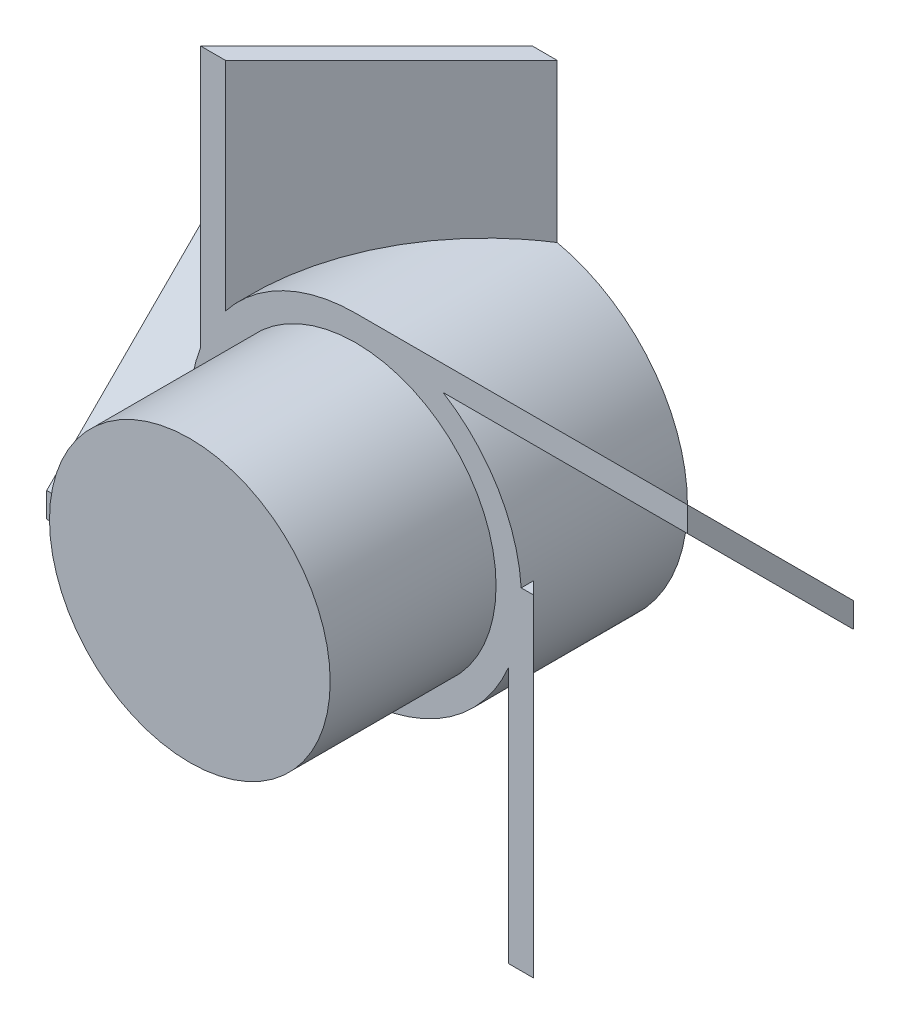
ISO-10303-21;
HEADER;
FILE_DESCRIPTION(('STEP AP214'),'2;1');
FILE_NAME('part.step','',(''),(''),'','','');
FILE_SCHEMA(('AUTOMOTIVE_DESIGN { 1 0 10303 214 1 1 1 1 }'));
ENDSEC;
DATA;
#1=APPLICATION_CONTEXT('core data for automotive mechanical design processes');
#2=APPLICATION_PROTOCOL_DEFINITION('international standard','automotive_design',2000,#1);
#3=PRODUCT_CONTEXT('',#1,'mechanical');
#4=PRODUCT('Part','Part','',(#3));
#5=PRODUCT_RELATED_PRODUCT_CATEGORY('part','',(#4));
#6=PRODUCT_DEFINITION_FORMATION('','',#4);
#7=PRODUCT_DEFINITION_CONTEXT('part definition',#1,'design');
#8=PRODUCT_DEFINITION('design','',#6,#7);
#9=PRODUCT_DEFINITION_SHAPE('','',#8);
#10=(LENGTH_UNIT() NAMED_UNIT(*) SI_UNIT(.MILLI.,.METRE.));
#11=(NAMED_UNIT(*) PLANE_ANGLE_UNIT() SI_UNIT($,.RADIAN.));
#12=(NAMED_UNIT(*) SI_UNIT($,.STERADIAN.) SOLID_ANGLE_UNIT());
#13=UNCERTAINTY_MEASURE_WITH_UNIT(LENGTH_MEASURE(1.E-05),#10,'distance_accuracy_value','');
#14=(GEOMETRIC_REPRESENTATION_CONTEXT(3) GLOBAL_UNCERTAINTY_ASSIGNED_CONTEXT((#13)) GLOBAL_UNIT_ASSIGNED_CONTEXT((#10,
#11,#12)) REPRESENTATION_CONTEXT('',''));
#15=CARTESIAN_POINT('',(0.,0.,0.));
#16=DIRECTION('',(0.,0.,1.));
#17=DIRECTION('',(1.,0.,0.));
#18=AXIS2_PLACEMENT_3D('',#15,#16,#17);
#19=CARTESIAN_POINT('',(0.,0.,10.));
#20=DIRECTION('',(0.,0.,-1.));
#21=DIRECTION('',(-1.,0.,0.));
#22=AXIS2_PLACEMENT_3D('',#19,#20,#21);
#23=CYLINDRICAL_SURFACE('',#22,20.);
#24=CARTESIAN_POINT('',(0.,0.,-8.43903231666362));
#25=DIRECTION('',(0.707106781186546,0.,-0.707106781186549));
#26=DIRECTION('',(-0.707106781186549,0.,-0.707106781186546));
#27=AXIS2_PLACEMENT_3D('',#24,#25,#26);
#28=ELLIPSE('',#27,28.2842712474619,20.);
#29=CARTESIAN_POINT('',(18.4390323166637,-7.74610142103972,10.));
#30=VERTEX_POINT('',#29);
#31=CARTESIAN_POINT('',(-1.56096768333645,-19.9389914461986,-10.));
#32=VERTEX_POINT('',#31);
#33=EDGE_CURVE('E287',#30,#32,#28,.T.);
#34=ORIENTED_EDGE('',*,*,#33,.F.);
#35=CARTESIAN_POINT('',(0.,0.,10.));
#36=DIRECTION('',(0.,0.,1.));
#37=DIRECTION('',(1.,0.,0.));
#38=AXIS2_PLACEMENT_3D('',#35,#36,#37);
#39=CIRCLE('',#38,20.);
#40=CARTESIAN_POINT('',(2.7406043560929,-19.8113373542365,10.));
#41=VERTEX_POINT('',#40);
#42=EDGE_CURVE('E370',#41,#30,#39,.T.);
#43=ORIENTED_EDGE('',*,*,#42,.F.);
#44=DIRECTION('',(0.,0.,-1.));
#45=VECTOR('',#44,1.);
#46=CARTESIAN_POINT('',(2.7406043560929,-19.8113373542365,10.));
#47=LINE('',#46,#45);
#48=CARTESIAN_POINT('',(2.7406043560929,-19.8113373542365,9.67387707700207));
#49=VERTEX_POINT('',#48);
#50=EDGE_CURVE('E66',#49,#41,#47,.F.);
#51=ORIENTED_EDGE('',*,*,#50,.F.);
#52=CARTESIAN_POINT('',(0.,0.,-10.1374602772343));
#53=DIRECTION('',(0.,0.707106781186546,0.707106781186549));
#54=DIRECTION('',(0.,0.707106781186549,-0.707106781186546));
#55=AXIS2_PLACEMENT_3D('',#52,#53,#54);
#56=ELLIPSE('',#55,28.2842712474619,20.);
#57=CARTESIAN_POINT('',(-19.9995276112258,-0.137460277234326,-10.));
#58=VERTEX_POINT('',#57);
#59=EDGE_CURVE('E290',#58,#49,#56,.T.);
#60=ORIENTED_EDGE('',*,*,#59,.F.);
#61=CARTESIAN_POINT('',(0.,0.,-10.));
#62=DIRECTION('',(0.,0.,1.));
#63=DIRECTION('',(1.,0.,0.));
#64=AXIS2_PLACEMENT_3D('',#61,#62,#63);
#65=CIRCLE('',#64,20.);
#66=EDGE_CURVE('E395',#58,#32,#65,.T.);
#67=ORIENTED_EDGE('',*,*,#66,.T.);
#68=EDGE_LOOP('',(#34,#43,#51,#60,#67));
#69=FACE_BOUND('',#68,.T.);
#70=ADVANCED_FACE('F44',(#69),#23,.T.);
#71=CARTESIAN_POINT('',(0.,0.,-11.4390323166636));
#72=DIRECTION('',(-0.707106781186546,0.,0.707106781186549));
#73=DIRECTION('',(-0.707106781186549,0.,-0.707106781186546));
#74=AXIS2_PLACEMENT_3D('',#71,#72,#73);
#75=ELLIPSE('',#74,28.2842712474619,20.);
#76=CARTESIAN_POINT('',(1.43903231666354,-19.9481624715561,-10.));
#77=VERTEX_POINT('',#76);
#78=CARTESIAN_POINT('',(19.9576028176276,1.30157203942922,8.5185705009639));
#79=VERTEX_POINT('',#78);
#80=EDGE_CURVE('E295',#77,#79,#75,.T.);
#81=ORIENTED_EDGE('',*,*,#80,.F.);
#82=CARTESIAN_POINT('',(19.7737199332852,-3.,-10.));
#83=VERTEX_POINT('',#82);
#84=EDGE_CURVE('E336',#77,#83,#65,.T.);
#85=ORIENTED_EDGE('',*,*,#84,.T.);
#86=CARTESIAN_POINT('',(0.,0.,-7.00000000000001));
#87=DIRECTION('',(0.,0.707106781186546,-0.707106781186549));
#88=DIRECTION('',(0.,-0.707106781186549,-0.707106781186546));
#89=AXIS2_PLACEMENT_3D('',#86,#87,#88);
#90=ELLIPSE('',#89,28.2842712474619,20.);
#91=CARTESIAN_POINT('',(10.5356537528526,17.0000000000001,10.));
#92=VERTEX_POINT('',#91);
#93=EDGE_CURVE('E52',#92,#83,#90,.T.);
#94=ORIENTED_EDGE('',*,*,#93,.F.);
#95=CARTESIAN_POINT('',(19.9576028176276,1.30157203942922,10.));
#96=VERTEX_POINT('',#95);
#97=EDGE_CURVE('E343',#96,#92,#39,.T.);
#98=ORIENTED_EDGE('',*,*,#97,.F.);
#99=DIRECTION('',(0.,0.,-1.));
#100=VECTOR('',#99,1.);
#101=CARTESIAN_POINT('',(19.9576028176276,1.30157203942922,10.));
#102=LINE('',#101,#100);
#103=EDGE_CURVE('E58',#79,#96,#102,.F.);
#104=ORIENTED_EDGE('',*,*,#103,.F.);
#105=EDGE_LOOP('',(#81,#85,#94,#98,#104));
#106=FACE_BOUND('',#105,.T.);
#107=ADVANCED_FACE('F396',(#106),#23,.T.);
#108=CARTESIAN_POINT('',(0.,0.,-7.13746027723433));
#109=DIRECTION('',(0.,-0.707106781186546,-0.707106781186549));
#110=DIRECTION('',(0.,0.707106781186549,-0.707106781186546));
#111=AXIS2_PLACEMENT_3D('',#108,#109,#110);
#112=ELLIPSE('',#111,28.2842712474619,20.);
#113=CARTESIAN_POINT('',(-10.3105506761867,-17.1374602772344,10.));
#114=VERTEX_POINT('',#113);
#115=CARTESIAN_POINT('',(-19.7940866507043,2.86253972276567,-10.));
#116=VERTEX_POINT('',#115);
#117=EDGE_CURVE('E281',#114,#116,#112,.T.);
#118=ORIENTED_EDGE('',*,*,#117,.F.);
#119=CARTESIAN_POINT('',(-18.6984279605707,7.0970974210129,10.));
#120=VERTEX_POINT('',#119);
#121=EDGE_CURVE('E342',#120,#114,#39,.T.);
#122=ORIENTED_EDGE('',*,*,#121,.F.);
#123=CARTESIAN_POINT('',(0.,0.,-8.69842796057072));
#124=DIRECTION('',(0.707106781186546,0.,0.707106781186549));
#125=DIRECTION('',(0.707106781186549,0.,-0.707106781186546));
#126=AXIS2_PLACEMENT_3D('',#123,#124,#125);
#127=ELLIPSE('',#126,28.2842712474619,20.);
#128=CARTESIAN_POINT('',(1.3015720394295,19.9576028176276,-10.));
#129=VERTEX_POINT('',#128);
#130=EDGE_CURVE('E279',#129,#120,#127,.T.);
#131=ORIENTED_EDGE('',*,*,#130,.F.);
#132=EDGE_CURVE('E200',#129,#116,#65,.T.);
#133=ORIENTED_EDGE('',*,*,#132,.T.);
#134=EDGE_LOOP('',(#118,#122,#131,#133));
#135=FACE_BOUND('',#134,.T.);
#136=ADVANCED_FACE('F422',(#135),#23,.T.);
#137=CARTESIAN_POINT('',(0.,0.,-5.69842796057072));
#138=DIRECTION('',(-0.707106781186546,0.,-0.707106781186549));
#139=DIRECTION('',(0.707106781186549,0.,-0.707106781186546));
#140=AXIS2_PLACEMENT_3D('',#137,#138,#139);
#141=ELLIPSE('',#140,28.2842712474619,20.);
#142=CARTESIAN_POINT('',(-15.6984279605706,12.391907018969,10.));
#143=VERTEX_POINT('',#142);
#144=CARTESIAN_POINT('',(4.30157203942949,19.5319348245277,-10.));
#145=VERTEX_POINT('',#144);
#146=EDGE_CURVE('E276',#143,#145,#141,.T.);
#147=ORIENTED_EDGE('',*,*,#146,.F.);
#148=CARTESIAN_POINT('',(0.,20.,10.));
#149=VERTEX_POINT('',#148);
#150=EDGE_CURVE('E339',#149,#143,#39,.T.);
#151=ORIENTED_EDGE('',*,*,#150,.F.);
#152=CARTESIAN_POINT('',(0.,0.,-10.));
#153=DIRECTION('',(0.,-0.707106781186546,0.707106781186549));
#154=DIRECTION('',(0.,-0.707106781186549,-0.707106781186546));
#155=AXIS2_PLACEMENT_3D('',#152,#153,#154);
#156=ELLIPSE('',#155,28.2842712474619,20.);
#157=CARTESIAN_POINT('',(20.,0.,-10.));
#158=VERTEX_POINT('',#157);
#159=EDGE_CURVE('E11',#158,#149,#156,.T.);
#160=ORIENTED_EDGE('',*,*,#159,.F.);
#161=EDGE_CURVE('E344',#158,#145,#65,.T.);
#162=ORIENTED_EDGE('',*,*,#161,.T.);
#163=EDGE_LOOP('',(#147,#151,#160,#162));
#164=FACE_BOUND('',#163,.T.);
#165=ADVANCED_FACE('F420',(#164),#23,.T.);
#166=CARTESIAN_POINT('',(0.,0.,10.));
#167=DIRECTION('',(0.,0.,1.));
#168=DIRECTION('',(1.,0.,0.));
#169=AXIS2_PLACEMENT_3D('',#166,#167,#168);
#170=PLANE('',#169);
#171=CARTESIAN_POINT('',(0.,0.,10.));
#172=DIRECTION('',(0.,0.,1.));
#173=DIRECTION('',(1.,0.,0.));
#174=AXIS2_PLACEMENT_3D('',#171,#172,#173);
#175=CIRCLE('',#174,16.925);
#176=CARTESIAN_POINT('',(16.925,0.,10.));
#177=VERTEX_POINT('',#176);
#178=EDGE_CURVE('E334',#177,#177,#175,.F.);
#179=ORIENTED_EDGE('',*,*,#178,.T.);
#180=EDGE_LOOP('',(#179));
#181=FACE_BOUND('',#180,.T.);
#182=ORIENTED_EDGE('',*,*,#150,.T.);
#183=DIRECTION('',(0.,-1.,0.));
#184=VECTOR('',#183,1.);
#185=CARTESIAN_POINT('',(-15.6984279605704,38.5609676833366,10.));
#186=LINE('',#185,#184);
#187=CARTESIAN_POINT('',(-15.6984279605704,38.5609676833366,10.));
#188=VERTEX_POINT('',#187);
#189=EDGE_CURVE('E202',#188,#143,#186,.T.);
#190=ORIENTED_EDGE('',*,*,#189,.F.);
#191=DIRECTION('',(1.,0.,0.));
#192=VECTOR('',#191,1.);
#193=CARTESIAN_POINT('',(-18.6984279605704,38.5609676833366,10.));
#194=LINE('',#193,#192);
#195=CARTESIAN_POINT('',(-18.6984279605704,38.5609676833366,10.));
#196=VERTEX_POINT('',#195);
#197=EDGE_CURVE('E181',#196,#188,#194,.T.);
#198=ORIENTED_EDGE('',*,*,#197,.F.);
#199=DIRECTION('',(0.,-1.,0.));
#200=VECTOR('',#199,1.);
#201=CARTESIAN_POINT('',(-18.6984279605704,38.5609676833366,10.));
#202=LINE('',#201,#200);
#203=EDGE_CURVE('E180',#196,#120,#202,.T.);
#204=ORIENTED_EDGE('',*,*,#203,.T.);
#205=ORIENTED_EDGE('',*,*,#121,.T.);
#206=DIRECTION('',(1.,0.,0.));
#207=VECTOR('',#206,1.);
#208=CARTESIAN_POINT('',(-37.2593956439071,-17.1374602772344,10.));
#209=LINE('',#208,#207);
#210=CARTESIAN_POINT('',(-37.2593956439071,-17.1374602772344,10.));
#211=VERTEX_POINT('',#210);
#212=EDGE_CURVE('E226',#211,#114,#209,.T.);
#213=ORIENTED_EDGE('',*,*,#212,.F.);
#214=DIRECTION('',(0.,1.,0.));
#215=VECTOR('',#214,1.);
#216=CARTESIAN_POINT('',(-37.2593956439071,-20.1374602772344,10.));
#217=LINE('',#216,#215);
#218=CARTESIAN_POINT('',(-37.2593956439071,-20.1374602772344,10.));
#219=VERTEX_POINT('',#218);
#220=EDGE_CURVE('E218',#219,#211,#217,.T.);
#221=ORIENTED_EDGE('',*,*,#220,.F.);
#222=DIRECTION('',(1.,0.,0.));
#223=VECTOR('',#222,1.);
#224=CARTESIAN_POINT('',(-37.2593956439071,-20.1374602772344,10.));
#225=LINE('',#224,#223);
#226=CARTESIAN_POINT('',(2.7406043560929,-20.1374602772344,10.));
#227=VERTEX_POINT('',#226);
#228=EDGE_CURVE('E235',#219,#227,#225,.T.);
#229=ORIENTED_EDGE('',*,*,#228,.T.);
#230=DIRECTION('',(0.,1.,0.));
#231=VECTOR('',#230,1.);
#232=CARTESIAN_POINT('',(2.7406043560929,-20.1374602772344,10.));
#233=LINE('',#232,#231);
#234=EDGE_CURVE('E201',#227,#41,#233,.T.);
#235=ORIENTED_EDGE('',*,*,#234,.T.);
#236=ORIENTED_EDGE('',*,*,#42,.T.);
#237=DIRECTION('',(0.,1.,0.));
#238=VECTOR('',#237,1.);
#239=CARTESIAN_POINT('',(18.4390323166635,-38.6984279605708,10.));
#240=LINE('',#239,#238);
#241=CARTESIAN_POINT('',(18.4390323166635,-38.6984279605708,10.));
#242=VERTEX_POINT('',#241);
#243=EDGE_CURVE('E262',#242,#30,#240,.T.);
#244=ORIENTED_EDGE('',*,*,#243,.F.);
#245=DIRECTION('',(-1.,0.,0.));
#246=VECTOR('',#245,1.);
#247=CARTESIAN_POINT('',(21.4390323166635,-38.6984279605708,10.));
#248=LINE('',#247,#246);
#249=CARTESIAN_POINT('',(21.4390323166635,-38.6984279605708,10.));
#250=VERTEX_POINT('',#249);
#251=EDGE_CURVE('E248',#250,#242,#248,.T.);
#252=ORIENTED_EDGE('',*,*,#251,.F.);
#253=DIRECTION('',(0.,1.,0.));
#254=VECTOR('',#253,1.);
#255=CARTESIAN_POINT('',(21.4390323166635,-38.6984279605708,10.));
#256=LINE('',#255,#254);
#257=CARTESIAN_POINT('',(21.4390323166637,1.30157203942922,10.));
#258=VERTEX_POINT('',#257);
#259=EDGE_CURVE('E266',#250,#258,#256,.T.);
#260=ORIENTED_EDGE('',*,*,#259,.T.);
#261=DIRECTION('',(-1.,0.,0.));
#262=VECTOR('',#261,1.);
#263=CARTESIAN_POINT('',(21.4390323166637,1.30157203942922,10.));
#264=LINE('',#263,#262);
#265=EDGE_CURVE('E246',#258,#96,#264,.T.);
#266=ORIENTED_EDGE('',*,*,#265,.T.);
#267=ORIENTED_EDGE('',*,*,#97,.T.);
#268=DIRECTION('',(-1.,0.,0.));
#269=VECTOR('',#268,1.);
#270=CARTESIAN_POINT('',(40.,17.0000000000001,10.));
#271=LINE('',#270,#269);
#272=CARTESIAN_POINT('',(40.,17.0000000000001,10.));
#273=VERTEX_POINT('',#272);
#274=EDGE_CURVE('E319',#273,#92,#271,.T.);
#275=ORIENTED_EDGE('',*,*,#274,.F.);
#276=DIRECTION('',(0.,-1.,0.));
#277=VECTOR('',#276,1.);
#278=CARTESIAN_POINT('',(40.,20.0000000000001,10.));
#279=LINE('',#278,#277);
#280=CARTESIAN_POINT('',(40.,20.0000000000001,10.));
#281=VERTEX_POINT('',#280);
#282=EDGE_CURVE('E308',#281,#273,#279,.T.);
#283=ORIENTED_EDGE('',*,*,#282,.F.);
#284=DIRECTION('',(-1.,0.,0.));
#285=VECTOR('',#284,1.);
#286=CARTESIAN_POINT('',(40.,20.0000000000001,10.));
#287=LINE('',#286,#285);
#288=EDGE_CURVE('E325',#281,#149,#287,.T.);
#289=ORIENTED_EDGE('',*,*,#288,.T.);
#290=EDGE_LOOP('',(#182,#190,#198,#204,#205,#213,#221,#229,#235,#236,#244,#252,#260,#266,#267,
#275,#283,#289));
#291=FACE_BOUND('',#290,.T.);
#292=ADVANCED_FACE('F364',(#181,#291),#170,.T.);
#293=CARTESIAN_POINT('',(0.,0.,-10.));
#294=DIRECTION('',(0.,0.,1.));
#295=DIRECTION('',(1.,0.,0.));
#296=AXIS2_PLACEMENT_3D('',#293,#294,#295);
#297=PLANE('',#296);
#298=ORIENTED_EDGE('',*,*,#84,.F.);
#299=DIRECTION('',(0.,1.,0.));
#300=VECTOR('',#299,1.);
#301=CARTESIAN_POINT('',(1.43903231666348,-38.6984279605707,-10.));
#302=LINE('',#301,#300);
#303=CARTESIAN_POINT('',(1.43903231666348,-38.6984279605707,-10.));
#304=VERTEX_POINT('',#303);
#305=EDGE_CURVE('E275',#304,#77,#302,.T.);
#306=ORIENTED_EDGE('',*,*,#305,.F.);
#307=DIRECTION('',(1.,0.,0.));
#308=VECTOR('',#307,1.);
#309=CARTESIAN_POINT('',(1.43903231666348,-38.6984279605707,-10.));
#310=LINE('',#309,#308);
#311=CARTESIAN_POINT('',(-1.56096768333652,-38.6984279605707,-10.));
#312=VERTEX_POINT('',#311);
#313=EDGE_CURVE('E241',#312,#304,#310,.T.);
#314=ORIENTED_EDGE('',*,*,#313,.F.);
#315=DIRECTION('',(0.,1.,0.));
#316=VECTOR('',#315,1.);
#317=CARTESIAN_POINT('',(-1.56096768333652,-38.6984279605707,-10.));
#318=LINE('',#317,#316);
#319=EDGE_CURVE('E253',#312,#32,#318,.T.);
#320=ORIENTED_EDGE('',*,*,#319,.T.);
#321=ORIENTED_EDGE('',*,*,#66,.F.);
#322=DIRECTION('',(1.,0.,0.));
#323=VECTOR('',#322,1.);
#324=CARTESIAN_POINT('',(-37.2593956439071,-0.137460277234326,-10.));
#325=LINE('',#324,#323);
#326=CARTESIAN_POINT('',(-37.2593956439071,-0.137460277234326,-10.));
#327=VERTEX_POINT('',#326);
#328=EDGE_CURVE('E236',#327,#58,#325,.T.);
#329=ORIENTED_EDGE('',*,*,#328,.F.);
#330=DIRECTION('',(0.,-1.,0.));
#331=VECTOR('',#330,1.);
#332=CARTESIAN_POINT('',(-37.2593956439071,-0.137460277234326,-10.));
#333=LINE('',#332,#331);
#334=CARTESIAN_POINT('',(-37.2593956439071,2.86253972276567,-10.));
#335=VERTEX_POINT('',#334);
#336=EDGE_CURVE('E209',#335,#327,#333,.T.);
#337=ORIENTED_EDGE('',*,*,#336,.F.);
#338=DIRECTION('',(1.,0.,0.));
#339=VECTOR('',#338,1.);
#340=CARTESIAN_POINT('',(-37.2593956439071,2.86253972276567,-10.));
#341=LINE('',#340,#339);
#342=EDGE_CURVE('E223',#335,#116,#341,.T.);
#343=ORIENTED_EDGE('',*,*,#342,.T.);
#344=ORIENTED_EDGE('',*,*,#132,.F.);
#345=DIRECTION('',(0.,-1.,0.));
#346=VECTOR('',#345,1.);
#347=CARTESIAN_POINT('',(1.30157203942969,38.5609676833364,-10.));
#348=LINE('',#347,#346);
#349=CARTESIAN_POINT('',(1.30157203942969,38.5609676833364,-10.));
#350=VERTEX_POINT('',#349);
#351=EDGE_CURVE('E174',#350,#129,#348,.T.);
#352=ORIENTED_EDGE('',*,*,#351,.F.);
#353=DIRECTION('',(-1.,0.,0.));
#354=VECTOR('',#353,1.);
#355=CARTESIAN_POINT('',(1.30157203942969,38.5609676833364,-10.));
#356=LINE('',#355,#354);
#357=CARTESIAN_POINT('',(4.30157203942969,38.5609676833364,-10.));
#358=VERTEX_POINT('',#357);
#359=EDGE_CURVE('E185',#358,#350,#356,.T.);
#360=ORIENTED_EDGE('',*,*,#359,.F.);
#361=DIRECTION('',(0.,-1.,0.));
#362=VECTOR('',#361,1.);
#363=CARTESIAN_POINT('',(4.30157203942969,38.5609676833364,-10.));
#364=LINE('',#363,#362);
#365=EDGE_CURVE('E436',#358,#145,#364,.T.);
#366=ORIENTED_EDGE('',*,*,#365,.T.);
#367=ORIENTED_EDGE('',*,*,#161,.F.);
#368=DIRECTION('',(-1.,0.,0.));
#369=VECTOR('',#368,1.);
#370=CARTESIAN_POINT('',(40.,0.,-10.));
#371=LINE('',#370,#369);
#372=CARTESIAN_POINT('',(40.,0.,-10.));
#373=VERTEX_POINT('',#372);
#374=EDGE_CURVE('E328',#373,#158,#371,.T.);
#375=ORIENTED_EDGE('',*,*,#374,.F.);
#376=DIRECTION('',(0.,1.,0.));
#377=VECTOR('',#376,1.);
#378=CARTESIAN_POINT('',(40.,0.,-10.));
#379=LINE('',#378,#377);
#380=CARTESIAN_POINT('',(40.,-3.,-10.));
#381=VERTEX_POINT('',#380);
#382=EDGE_CURVE('E301',#381,#373,#379,.T.);
#383=ORIENTED_EDGE('',*,*,#382,.F.);
#384=DIRECTION('',(-1.,0.,0.));
#385=VECTOR('',#384,1.);
#386=CARTESIAN_POINT('',(40.,-3.,-10.));
#387=LINE('',#386,#385);
#388=EDGE_CURVE('E313',#381,#83,#387,.T.);
#389=ORIENTED_EDGE('',*,*,#388,.T.);
#390=EDGE_LOOP('',(#298,#306,#314,#320,#321,#329,#337,#343,#344,#352,#360,#366,#367,#375,#383,#389));
#391=FACE_BOUND('',#390,.T.);
#392=ADVANCED_FACE('F194',(#391),#297,.F.);
#393=CARTESIAN_POINT('',(0.,0.,30.));
#394=DIRECTION('',(0.,0.,-1.));
#395=DIRECTION('',(-1.,0.,0.));
#396=AXIS2_PLACEMENT_3D('',#393,#394,#395);
#397=CYLINDRICAL_SURFACE('',#396,16.925);
#398=ORIENTED_EDGE('',*,*,#178,.F.);
#399=EDGE_LOOP('',(#398));
#400=FACE_BOUND('',#399,.T.);
#401=CARTESIAN_POINT('',(0.,0.,30.));
#402=DIRECTION('',(0.,0.,1.));
#403=DIRECTION('',(1.,0.,0.));
#404=AXIS2_PLACEMENT_3D('',#401,#402,#403);
#405=CIRCLE('',#404,16.925);
#406=CARTESIAN_POINT('',(16.925,0.,30.));
#407=VERTEX_POINT('',#406);
#408=EDGE_CURVE('E329',#407,#407,#405,.T.);
#409=ORIENTED_EDGE('',*,*,#408,.F.);
#410=EDGE_LOOP('',(#409));
#411=FACE_BOUND('',#410,.T.);
#412=ADVANCED_FACE('F452',(#400,#411),#397,.T.);
#413=CARTESIAN_POINT('',(0.,0.,30.));
#414=DIRECTION('',(0.,0.,1.));
#415=DIRECTION('',(1.,0.,0.));
#416=AXIS2_PLACEMENT_3D('',#413,#414,#415);
#417=PLANE('',#416);
#418=ORIENTED_EDGE('',*,*,#408,.T.);
#419=EDGE_LOOP('',(#418));
#420=FACE_BOUND('',#419,.T.);
#421=ADVANCED_FACE('F447',(#420),#417,.T.);
#422=CARTESIAN_POINT('',(40.,0.,-10.));
#423=DIRECTION('',(0.,-0.707106781186546,0.707106781186549));
#424=DIRECTION('',(0.,-0.707106781186549,-0.707106781186546));
#425=AXIS2_PLACEMENT_3D('',#422,#423,#424);
#426=PLANE('',#425);
#427=ORIENTED_EDGE('',*,*,#374,.T.);
#428=ORIENTED_EDGE('',*,*,#159,.T.);
#429=ORIENTED_EDGE('',*,*,#288,.F.);
#430=DIRECTION('',(0.,0.707106781186549,0.707106781186546));
#431=VECTOR('',#430,1.);
#432=CARTESIAN_POINT('',(40.,0.,-10.));
#433=LINE('',#432,#431);
#434=EDGE_CURVE('E304',#373,#281,#433,.T.);
#435=ORIENTED_EDGE('',*,*,#434,.F.);
#436=EDGE_LOOP('',(#427,#428,#429,#435));
#437=FACE_BOUND('',#436,.T.);
#438=ADVANCED_FACE('F443',(#437),#426,.F.);
#439=CARTESIAN_POINT('',(40.,17.0000000000001,10.));
#440=DIRECTION('',(0.,0.707106781186546,-0.707106781186549));
#441=DIRECTION('',(0.,0.707106781186549,0.707106781186546));
#442=AXIS2_PLACEMENT_3D('',#439,#440,#441);
#443=PLANE('',#442);
#444=ORIENTED_EDGE('',*,*,#274,.T.);
#445=ORIENTED_EDGE('',*,*,#93,.T.);
#446=ORIENTED_EDGE('',*,*,#388,.F.);
#447=DIRECTION('',(0.,-0.707106781186549,-0.707106781186546));
#448=VECTOR('',#447,1.);
#449=CARTESIAN_POINT('',(40.,17.0000000000001,10.));
#450=LINE('',#449,#448);
#451=EDGE_CURVE('E311',#273,#381,#450,.T.);
#452=ORIENTED_EDGE('',*,*,#451,.F.);
#453=EDGE_LOOP('',(#444,#445,#446,#452));
#454=FACE_BOUND('',#453,.T.);
#455=ADVANCED_FACE('F355',(#454),#443,.F.);
#456=CARTESIAN_POINT('',(40.,0.,0.));
#457=DIRECTION('',(1.,0.,0.));
#458=DIRECTION('',(0.,0.,-1.));
#459=AXIS2_PLACEMENT_3D('',#456,#457,#458);
#460=PLANE('',#459);
#461=ORIENTED_EDGE('',*,*,#382,.T.);
#462=ORIENTED_EDGE('',*,*,#434,.T.);
#463=ORIENTED_EDGE('',*,*,#282,.T.);
#464=ORIENTED_EDGE('',*,*,#451,.T.);
#465=EDGE_LOOP('',(#461,#462,#463,#464));
#466=FACE_BOUND('',#465,.T.);
#467=ADVANCED_FACE('F359',(#466),#460,.T.);
#468=CARTESIAN_POINT('',(1.30157203942969,38.5609676833364,0.));
#469=DIRECTION('',(0.,1.,0.));
#470=DIRECTION('',(0.,0.,-1.));
#471=AXIS2_PLACEMENT_3D('',#468,#469,#470);
#472=PLANE('',#471);
#473=ORIENTED_EDGE('',*,*,#359,.T.);
#474=DIRECTION('',(-0.707106781186549,0.,0.707106781186546));
#475=VECTOR('',#474,1.);
#476=CARTESIAN_POINT('',(1.30157203942969,38.5609676833364,-10.));
#477=LINE('',#476,#475);
#478=EDGE_CURVE('E167',#350,#196,#477,.T.);
#479=ORIENTED_EDGE('',*,*,#478,.T.);
#480=ORIENTED_EDGE('',*,*,#197,.T.);
#481=DIRECTION('',(0.707106781186549,0.,-0.707106781186546));
#482=VECTOR('',#481,1.);
#483=CARTESIAN_POINT('',(-15.6984279605704,38.5609676833366,10.));
#484=LINE('',#483,#482);
#485=EDGE_CURVE('E190',#188,#358,#484,.T.);
#486=ORIENTED_EDGE('',*,*,#485,.T.);
#487=EDGE_LOOP('',(#473,#479,#480,#486));
#488=FACE_BOUND('',#487,.T.);
#489=ADVANCED_FACE('F184',(#488),#472,.T.);
#490=CARTESIAN_POINT('',(1.30157203942969,38.5609676833364,-10.));
#491=DIRECTION('',(0.707106781186546,0.,0.707106781186549));
#492=DIRECTION('',(0.707106781186549,0.,-0.707106781186546));
#493=AXIS2_PLACEMENT_3D('',#490,#491,#492);
#494=PLANE('',#493);
#495=ORIENTED_EDGE('',*,*,#351,.T.);
#496=ORIENTED_EDGE('',*,*,#130,.T.);
#497=ORIENTED_EDGE('',*,*,#203,.F.);
#498=ORIENTED_EDGE('',*,*,#478,.F.);
#499=EDGE_LOOP('',(#495,#496,#497,#498));
#500=FACE_BOUND('',#499,.T.);
#501=ADVANCED_FACE('F175',(#500),#494,.F.);
#502=CARTESIAN_POINT('',(-15.6984279605704,38.5609676833366,10.));
#503=DIRECTION('',(-0.707106781186546,0.,-0.707106781186549));
#504=DIRECTION('',(-0.707106781186549,0.,0.707106781186546));
#505=AXIS2_PLACEMENT_3D('',#502,#503,#504);
#506=PLANE('',#505);
#507=ORIENTED_EDGE('',*,*,#189,.T.);
#508=ORIENTED_EDGE('',*,*,#146,.T.);
#509=ORIENTED_EDGE('',*,*,#365,.F.);
#510=ORIENTED_EDGE('',*,*,#485,.F.);
#511=EDGE_LOOP('',(#507,#508,#509,#510));
#512=FACE_BOUND('',#511,.T.);
#513=ADVANCED_FACE('F432',(#512),#506,.F.);
#514=CARTESIAN_POINT('',(-37.2593956439071,-0.137460277234326,0.));
#515=DIRECTION('',(-1.,0.,0.));
#516=DIRECTION('',(0.,0.,-1.));
#517=AXIS2_PLACEMENT_3D('',#514,#515,#516);
#518=PLANE('',#517);
#519=ORIENTED_EDGE('',*,*,#336,.T.);
#520=DIRECTION('',(0.,-0.707106781186549,0.707106781186546));
#521=VECTOR('',#520,1.);
#522=CARTESIAN_POINT('',(-37.2593956439071,-0.137460277234326,-10.));
#523=LINE('',#522,#521);
#524=EDGE_CURVE('E212',#327,#219,#523,.T.);
#525=ORIENTED_EDGE('',*,*,#524,.T.);
#526=ORIENTED_EDGE('',*,*,#220,.T.);
#527=DIRECTION('',(0.,0.707106781186549,-0.707106781186546));
#528=VECTOR('',#527,1.);
#529=CARTESIAN_POINT('',(-37.2593956439071,-17.1374602772344,10.));
#530=LINE('',#529,#528);
#531=EDGE_CURVE('E217',#211,#335,#530,.T.);
#532=ORIENTED_EDGE('',*,*,#531,.T.);
#533=EDGE_LOOP('',(#519,#525,#526,#532));
#534=FACE_BOUND('',#533,.T.);
#535=ADVANCED_FACE('F385',(#534),#518,.T.);
#536=CARTESIAN_POINT('',(2.7406043560929,-0.137460277234326,0.));
#537=DIRECTION('',(-1.,0.,0.));
#538=DIRECTION('',(0.,0.,-1.));
#539=AXIS2_PLACEMENT_3D('',#536,#537,#538);
#540=PLANE('',#539);
#541=DIRECTION('',(0.,-0.707106781186549,0.707106781186546));
#542=VECTOR('',#541,1.);
#543=CARTESIAN_POINT('',(2.7406043560929,-0.137460277234326,-10.));
#544=LINE('',#543,#542);
#545=EDGE_CURVE('E197',#49,#227,#544,.T.);
#546=ORIENTED_EDGE('',*,*,#545,.F.);
#547=ORIENTED_EDGE('',*,*,#50,.T.);
#548=ORIENTED_EDGE('',*,*,#234,.F.);
#549=EDGE_LOOP('',(#546,#547,#548));
#550=FACE_BOUND('',#549,.T.);
#551=ADVANCED_FACE('F388',(#550),#540,.F.);
#552=CARTESIAN_POINT('',(-37.2593956439071,-0.137460277234326,-10.));
#553=DIRECTION('',(0.,0.707106781186546,0.707106781186549));
#554=DIRECTION('',(0.,-0.707106781186549,0.707106781186546));
#555=AXIS2_PLACEMENT_3D('',#552,#553,#554);
#556=PLANE('',#555);
#557=ORIENTED_EDGE('',*,*,#328,.T.);
#558=ORIENTED_EDGE('',*,*,#59,.T.);
#559=ORIENTED_EDGE('',*,*,#545,.T.);
#560=ORIENTED_EDGE('',*,*,#228,.F.);
#561=ORIENTED_EDGE('',*,*,#524,.F.);
#562=EDGE_LOOP('',(#557,#558,#559,#560,#561));
#563=FACE_BOUND('',#562,.T.);
#564=ADVANCED_FACE('F389',(#563),#556,.F.);
#565=CARTESIAN_POINT('',(-37.2593956439071,-17.1374602772344,10.));
#566=DIRECTION('',(0.,-0.707106781186546,-0.707106781186549));
#567=DIRECTION('',(0.,0.707106781186549,-0.707106781186546));
#568=AXIS2_PLACEMENT_3D('',#565,#566,#567);
#569=PLANE('',#568);
#570=ORIENTED_EDGE('',*,*,#212,.T.);
#571=ORIENTED_EDGE('',*,*,#117,.T.);
#572=ORIENTED_EDGE('',*,*,#342,.F.);
#573=ORIENTED_EDGE('',*,*,#531,.F.);
#574=EDGE_LOOP('',(#570,#571,#572,#573));
#575=FACE_BOUND('',#574,.T.);
#576=ADVANCED_FACE('F377',(#575),#569,.F.);
#577=CARTESIAN_POINT('',(1.43903231666362,1.30157203942929,0.));
#578=DIRECTION('',(0.,-1.,0.));
#579=DIRECTION('',(0.,0.,-1.));
#580=AXIS2_PLACEMENT_3D('',#577,#578,#579);
#581=PLANE('',#580);
#582=DIRECTION('',(0.707106781186549,0.,0.707106781186546));
#583=VECTOR('',#582,1.);
#584=CARTESIAN_POINT('',(1.43903231666362,1.30157203942929,-10.));
#585=LINE('',#584,#583);
#586=EDGE_CURVE('E239',#79,#258,#585,.T.);
#587=ORIENTED_EDGE('',*,*,#586,.F.);
#588=ORIENTED_EDGE('',*,*,#103,.T.);
#589=ORIENTED_EDGE('',*,*,#265,.F.);
#590=EDGE_LOOP('',(#587,#588,#589));
#591=FACE_BOUND('',#590,.T.);
#592=ADVANCED_FACE('F404',(#591),#581,.F.);
#593=CARTESIAN_POINT('',(1.43903231666348,-38.6984279605707,-10.));
#594=DIRECTION('',(-0.707106781186546,0.,0.707106781186549));
#595=DIRECTION('',(0.707106781186549,0.,0.707106781186546));
#596=AXIS2_PLACEMENT_3D('',#593,#594,#595);
#597=PLANE('',#596);
#598=ORIENTED_EDGE('',*,*,#305,.T.);
#599=ORIENTED_EDGE('',*,*,#80,.T.);
#600=ORIENTED_EDGE('',*,*,#586,.T.);
#601=ORIENTED_EDGE('',*,*,#259,.F.);
#602=DIRECTION('',(0.707106781186549,0.,0.707106781186546));
#603=VECTOR('',#602,1.);
#604=CARTESIAN_POINT('',(1.43903231666348,-38.6984279605707,-10.));
#605=LINE('',#604,#603);
#606=EDGE_CURVE('E244',#304,#250,#605,.T.);
#607=ORIENTED_EDGE('',*,*,#606,.F.);
#608=EDGE_LOOP('',(#598,#599,#600,#601,#607));
#609=FACE_BOUND('',#608,.T.);
#610=ADVANCED_FACE('F402',(#609),#597,.F.);
#611=CARTESIAN_POINT('',(18.4390323166635,-38.6984279605708,10.));
#612=DIRECTION('',(0.707106781186546,0.,-0.707106781186549));
#613=DIRECTION('',(-0.707106781186549,0.,-0.707106781186546));
#614=AXIS2_PLACEMENT_3D('',#611,#612,#613);
#615=PLANE('',#614);
#616=ORIENTED_EDGE('',*,*,#243,.T.);
#617=ORIENTED_EDGE('',*,*,#33,.T.);
#618=ORIENTED_EDGE('',*,*,#319,.F.);
#619=DIRECTION('',(-0.707106781186549,0.,-0.707106781186546));
#620=VECTOR('',#619,1.);
#621=CARTESIAN_POINT('',(18.4390323166635,-38.6984279605708,10.));
#622=LINE('',#621,#620);
#623=EDGE_CURVE('E255',#242,#312,#622,.T.);
#624=ORIENTED_EDGE('',*,*,#623,.F.);
#625=EDGE_LOOP('',(#616,#617,#618,#624));
#626=FACE_BOUND('',#625,.T.);
#627=ADVANCED_FACE('F413',(#626),#615,.F.);
#628=CARTESIAN_POINT('',(1.43903231666348,-38.6984279605707,0.));
#629=DIRECTION('',(0.,-1.,0.));
#630=DIRECTION('',(0.,0.,-1.));
#631=AXIS2_PLACEMENT_3D('',#628,#629,#630);
#632=PLANE('',#631);
#633=ORIENTED_EDGE('',*,*,#313,.T.);
#634=ORIENTED_EDGE('',*,*,#606,.T.);
#635=ORIENTED_EDGE('',*,*,#251,.T.);
#636=ORIENTED_EDGE('',*,*,#623,.T.);
#637=EDGE_LOOP('',(#633,#634,#635,#636));
#638=FACE_BOUND('',#637,.T.);
#639=ADVANCED_FACE('F538',(#638),#632,.T.);
#640=CLOSED_SHELL('',(#70,#107,#136,#165,#292,#392,#412,#421,#438,#455,#467,#489,#501,#513,#535,
#551,#564,#576,#592,#610,#627,#639));
#641=MANIFOLD_SOLID_BREP('B2',#640);
#642=ADVANCED_BREP_SHAPE_REPRESENTATION('',(#18,#641),#14);
#643=SHAPE_DEFINITION_REPRESENTATION(#9,#642);
ENDSEC;
END-ISO-10303-21;
